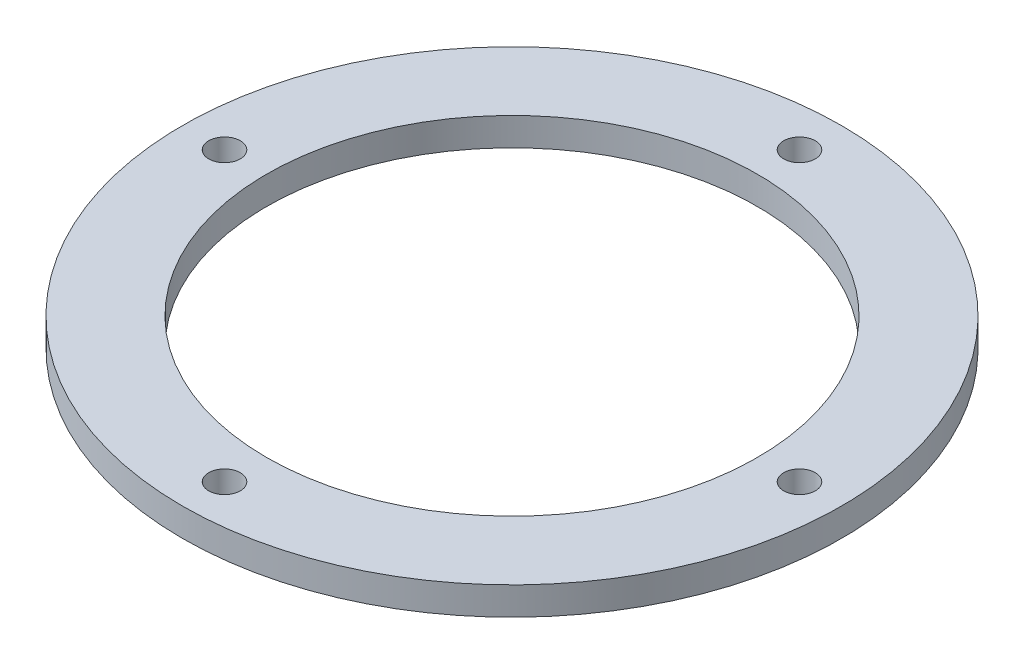
ISO-10303-21;
HEADER;
FILE_DESCRIPTION(('STEP AP214'),'2;1');
FILE_NAME('part.step','',(''),(''),'','','');
FILE_SCHEMA(('AUTOMOTIVE_DESIGN { 1 0 10303 214 1 1 1 1 }'));
ENDSEC;
DATA;
#1=APPLICATION_CONTEXT('core data for automotive mechanical design processes');
#2=APPLICATION_PROTOCOL_DEFINITION('international standard','automotive_design',2000,#1);
#3=PRODUCT_CONTEXT('',#1,'mechanical');
#4=PRODUCT('Part','Part','',(#3));
#5=PRODUCT_RELATED_PRODUCT_CATEGORY('part','',(#4));
#6=PRODUCT_DEFINITION_FORMATION('','',#4);
#7=PRODUCT_DEFINITION_CONTEXT('part definition',#1,'design');
#8=PRODUCT_DEFINITION('design','',#6,#7);
#9=PRODUCT_DEFINITION_SHAPE('','',#8);
#10=(LENGTH_UNIT() NAMED_UNIT(*) SI_UNIT(.MILLI.,.METRE.));
#11=(NAMED_UNIT(*) PLANE_ANGLE_UNIT() SI_UNIT($,.RADIAN.));
#12=(NAMED_UNIT(*) SI_UNIT($,.STERADIAN.) SOLID_ANGLE_UNIT());
#13=UNCERTAINTY_MEASURE_WITH_UNIT(LENGTH_MEASURE(1.E-05),#10,'distance_accuracy_value','');
#14=(GEOMETRIC_REPRESENTATION_CONTEXT(3) GLOBAL_UNCERTAINTY_ASSIGNED_CONTEXT((#13)) GLOBAL_UNIT_ASSIGNED_CONTEXT((#10,
#11,#12)) REPRESENTATION_CONTEXT('',''));
#15=CARTESIAN_POINT('',(0.,0.,0.));
#16=DIRECTION('',(0.,0.,1.));
#17=DIRECTION('',(1.,0.,0.));
#18=AXIS2_PLACEMENT_3D('',#15,#16,#17);
#19=CARTESIAN_POINT('',(0.,4.,0.));
#20=DIRECTION('',(0.,1.,0.));
#21=DIRECTION('',(0.,0.,1.));
#22=AXIS2_PLACEMENT_3D('',#19,#20,#21);
#23=PLANE('',#22);
#24=CARTESIAN_POINT('',(41.,4.,0.));
#25=DIRECTION('',(0.,1.,0.));
#26=DIRECTION('',(0.,0.,1.));
#27=AXIS2_PLACEMENT_3D('',#24,#25,#26);
#28=CIRCLE('',#27,2.25);
#29=CARTESIAN_POINT('',(41.,4.,2.25));
#30=VERTEX_POINT('',#29);
#31=EDGE_CURVE('E72',#30,#30,#28,.T.);
#32=ORIENTED_EDGE('',*,*,#31,.F.);
#33=EDGE_LOOP('',(#32));
#34=FACE_BOUND('',#33,.T.);
#35=CARTESIAN_POINT('',(0.,4.,41.));
#36=DIRECTION('',(0.,1.,0.));
#37=DIRECTION('',(0.,0.,1.));
#38=AXIS2_PLACEMENT_3D('',#35,#36,#37);
#39=CIRCLE('',#38,2.25);
#40=CARTESIAN_POINT('',(0.,4.,43.25));
#41=VERTEX_POINT('',#40);
#42=EDGE_CURVE('E69',#41,#41,#39,.T.);
#43=ORIENTED_EDGE('',*,*,#42,.F.);
#44=EDGE_LOOP('',(#43));
#45=FACE_BOUND('',#44,.T.);
#46=CARTESIAN_POINT('',(-41.,4.,0.));
#47=DIRECTION('',(0.,1.,0.));
#48=DIRECTION('',(0.,0.,1.));
#49=AXIS2_PLACEMENT_3D('',#46,#47,#48);
#50=CIRCLE('',#49,2.25);
#51=CARTESIAN_POINT('',(-41.,4.,2.25));
#52=VERTEX_POINT('',#51);
#53=EDGE_CURVE('E63',#52,#52,#50,.T.);
#54=ORIENTED_EDGE('',*,*,#53,.F.);
#55=EDGE_LOOP('',(#54));
#56=FACE_BOUND('',#55,.T.);
#57=CARTESIAN_POINT('',(0.,4.,-41.));
#58=DIRECTION('',(0.,1.,0.));
#59=DIRECTION('',(0.,0.,1.));
#60=AXIS2_PLACEMENT_3D('',#57,#58,#59);
#61=CIRCLE('',#60,2.25);
#62=CARTESIAN_POINT('',(0.,4.,-38.75));
#63=VERTEX_POINT('',#62);
#64=EDGE_CURVE('E57',#63,#63,#61,.T.);
#65=ORIENTED_EDGE('',*,*,#64,.F.);
#66=EDGE_LOOP('',(#65));
#67=FACE_BOUND('',#66,.T.);
#68=CARTESIAN_POINT('',(0.,4.,0.));
#69=DIRECTION('',(0.,1.,0.));
#70=DIRECTION('',(0.,0.,1.));
#71=AXIS2_PLACEMENT_3D('',#68,#69,#70);
#72=CIRCLE('',#71,47.);
#73=CARTESIAN_POINT('',(0.,4.,47.));
#74=VERTEX_POINT('',#73);
#75=EDGE_CURVE('E10',#74,#74,#72,.T.);
#76=ORIENTED_EDGE('',*,*,#75,.T.);
#77=EDGE_LOOP('',(#76));
#78=FACE_BOUND('',#77,.T.);
#79=CARTESIAN_POINT('',(0.,4.,0.));
#80=DIRECTION('',(0.,1.,0.));
#81=DIRECTION('',(0.,0.,1.));
#82=AXIS2_PLACEMENT_3D('',#79,#80,#81);
#83=CIRCLE('',#82,35.);
#84=CARTESIAN_POINT('',(0.,4.,35.));
#85=VERTEX_POINT('',#84);
#86=EDGE_CURVE('E46',#85,#85,#83,.T.);
#87=ORIENTED_EDGE('',*,*,#86,.F.);
#88=EDGE_LOOP('',(#87));
#89=FACE_BOUND('',#88,.T.);
#90=ADVANCED_FACE('F35',(#34,#45,#56,#67,#78,#89),#23,.T.);
#91=CARTESIAN_POINT('',(0.,0.,0.));
#92=DIRECTION('',(0.,1.,0.));
#93=DIRECTION('',(0.,0.,1.));
#94=AXIS2_PLACEMENT_3D('',#91,#92,#93);
#95=PLANE('',#94);
#96=CARTESIAN_POINT('',(41.,0.,0.));
#97=DIRECTION('',(0.,1.,0.));
#98=DIRECTION('',(0.,0.,1.));
#99=AXIS2_PLACEMENT_3D('',#96,#97,#98);
#100=CIRCLE('',#99,2.25);
#101=CARTESIAN_POINT('',(41.,0.,2.25));
#102=VERTEX_POINT('',#101);
#103=EDGE_CURVE('E51',#102,#102,#100,.T.);
#104=ORIENTED_EDGE('',*,*,#103,.T.);
#105=EDGE_LOOP('',(#104));
#106=FACE_BOUND('',#105,.T.);
#107=CARTESIAN_POINT('',(0.,0.,41.));
#108=DIRECTION('',(0.,1.,0.));
#109=DIRECTION('',(0.,0.,1.));
#110=AXIS2_PLACEMENT_3D('',#107,#108,#109);
#111=CIRCLE('',#110,2.25);
#112=CARTESIAN_POINT('',(0.,0.,43.25));
#113=VERTEX_POINT('',#112);
#114=EDGE_CURVE('E66',#113,#113,#111,.T.);
#115=ORIENTED_EDGE('',*,*,#114,.T.);
#116=EDGE_LOOP('',(#115));
#117=FACE_BOUND('',#116,.T.);
#118=CARTESIAN_POINT('',(-41.,0.,0.));
#119=DIRECTION('',(0.,1.,0.));
#120=DIRECTION('',(0.,0.,1.));
#121=AXIS2_PLACEMENT_3D('',#118,#119,#120);
#122=CIRCLE('',#121,2.25);
#123=CARTESIAN_POINT('',(-41.,0.,2.25));
#124=VERTEX_POINT('',#123);
#125=EDGE_CURVE('E60',#124,#124,#122,.T.);
#126=ORIENTED_EDGE('',*,*,#125,.T.);
#127=EDGE_LOOP('',(#126));
#128=FACE_BOUND('',#127,.T.);
#129=CARTESIAN_POINT('',(0.,0.,-41.));
#130=DIRECTION('',(0.,1.,0.));
#131=DIRECTION('',(0.,0.,1.));
#132=AXIS2_PLACEMENT_3D('',#129,#130,#131);
#133=CIRCLE('',#132,2.25);
#134=CARTESIAN_POINT('',(0.,0.,-38.75));
#135=VERTEX_POINT('',#134);
#136=EDGE_CURVE('E54',#135,#135,#133,.T.);
#137=ORIENTED_EDGE('',*,*,#136,.T.);
#138=EDGE_LOOP('',(#137));
#139=FACE_BOUND('',#138,.T.);
#140=CARTESIAN_POINT('',(0.,0.,0.));
#141=DIRECTION('',(0.,1.,0.));
#142=DIRECTION('',(0.,0.,1.));
#143=AXIS2_PLACEMENT_3D('',#140,#141,#142);
#144=CIRCLE('',#143,47.);
#145=CARTESIAN_POINT('',(0.,0.,47.));
#146=VERTEX_POINT('',#145);
#147=EDGE_CURVE('E39',#146,#146,#144,.T.);
#148=ORIENTED_EDGE('',*,*,#147,.F.);
#149=EDGE_LOOP('',(#148));
#150=FACE_BOUND('',#149,.T.);
#151=CARTESIAN_POINT('',(0.,0.,0.));
#152=DIRECTION('',(0.,1.,0.));
#153=DIRECTION('',(0.,0.,1.));
#154=AXIS2_PLACEMENT_3D('',#151,#152,#153);
#155=CIRCLE('',#154,35.);
#156=CARTESIAN_POINT('',(0.,0.,35.));
#157=VERTEX_POINT('',#156);
#158=EDGE_CURVE('E48',#157,#157,#155,.T.);
#159=ORIENTED_EDGE('',*,*,#158,.T.);
#160=EDGE_LOOP('',(#159));
#161=FACE_BOUND('',#160,.T.);
#162=ADVANCED_FACE('F78',(#106,#117,#128,#139,#150,#161),#95,.F.);
#163=CARTESIAN_POINT('',(0.,4.,0.));
#164=DIRECTION('',(0.,-1.,0.));
#165=DIRECTION('',(0.,0.,-1.));
#166=AXIS2_PLACEMENT_3D('',#163,#164,#165);
#167=CYLINDRICAL_SURFACE('',#166,47.);
#168=ORIENTED_EDGE('',*,*,#75,.F.);
#169=EDGE_LOOP('',(#168));
#170=FACE_BOUND('',#169,.T.);
#171=ORIENTED_EDGE('',*,*,#147,.T.);
#172=EDGE_LOOP('',(#171));
#173=FACE_BOUND('',#172,.T.);
#174=ADVANCED_FACE('F37',(#170,#173),#167,.T.);
#175=CARTESIAN_POINT('',(0.,4.,0.));
#176=DIRECTION('',(0.,-1.,0.));
#177=DIRECTION('',(0.,0.,-1.));
#178=AXIS2_PLACEMENT_3D('',#175,#176,#177);
#179=CYLINDRICAL_SURFACE('',#178,35.);
#180=ORIENTED_EDGE('',*,*,#86,.T.);
#181=EDGE_LOOP('',(#180));
#182=FACE_BOUND('',#181,.T.);
#183=ORIENTED_EDGE('',*,*,#158,.F.);
#184=EDGE_LOOP('',(#183));
#185=FACE_BOUND('',#184,.T.);
#186=ADVANCED_FACE('F99',(#182,#185),#179,.F.);
#187=CARTESIAN_POINT('',(0.,0.,-41.));
#188=DIRECTION('',(0.,1.,0.));
#189=DIRECTION('',(0.,0.,1.));
#190=AXIS2_PLACEMENT_3D('',#187,#188,#189);
#191=CYLINDRICAL_SURFACE('',#190,2.25);
#192=ORIENTED_EDGE('',*,*,#136,.F.);
#193=EDGE_LOOP('',(#192));
#194=FACE_BOUND('',#193,.T.);
#195=ORIENTED_EDGE('',*,*,#64,.T.);
#196=EDGE_LOOP('',(#195));
#197=FACE_BOUND('',#196,.T.);
#198=ADVANCED_FACE('F102',(#194,#197),#191,.F.);
#199=CARTESIAN_POINT('',(-41.,0.,0.));
#200=DIRECTION('',(0.,1.,0.));
#201=DIRECTION('',(0.,0.,1.));
#202=AXIS2_PLACEMENT_3D('',#199,#200,#201);
#203=CYLINDRICAL_SURFACE('',#202,2.25);
#204=ORIENTED_EDGE('',*,*,#125,.F.);
#205=EDGE_LOOP('',(#204));
#206=FACE_BOUND('',#205,.T.);
#207=ORIENTED_EDGE('',*,*,#53,.T.);
#208=EDGE_LOOP('',(#207));
#209=FACE_BOUND('',#208,.T.);
#210=ADVANCED_FACE('F114',(#206,#209),#203,.F.);
#211=CARTESIAN_POINT('',(0.,0.,41.));
#212=DIRECTION('',(0.,1.,0.));
#213=DIRECTION('',(0.,0.,1.));
#214=AXIS2_PLACEMENT_3D('',#211,#212,#213);
#215=CYLINDRICAL_SURFACE('',#214,2.25);
#216=ORIENTED_EDGE('',*,*,#114,.F.);
#217=EDGE_LOOP('',(#216));
#218=FACE_BOUND('',#217,.T.);
#219=ORIENTED_EDGE('',*,*,#42,.T.);
#220=EDGE_LOOP('',(#219));
#221=FACE_BOUND('',#220,.T.);
#222=ADVANCED_FACE('F84',(#218,#221),#215,.F.);
#223=CARTESIAN_POINT('',(41.,0.,0.));
#224=DIRECTION('',(0.,1.,0.));
#225=DIRECTION('',(0.,0.,1.));
#226=AXIS2_PLACEMENT_3D('',#223,#224,#225);
#227=CYLINDRICAL_SURFACE('',#226,2.25);
#228=ORIENTED_EDGE('',*,*,#103,.F.);
#229=EDGE_LOOP('',(#228));
#230=FACE_BOUND('',#229,.T.);
#231=ORIENTED_EDGE('',*,*,#31,.T.);
#232=EDGE_LOOP('',(#231));
#233=FACE_BOUND('',#232,.T.);
#234=ADVANCED_FACE('F81',(#230,#233),#227,.F.);
#235=CLOSED_SHELL('',(#90,#162,#174,#186,#198,#210,#222,#234));
#236=MANIFOLD_SOLID_BREP('B2',#235);
#237=ADVANCED_BREP_SHAPE_REPRESENTATION('',(#18,#236),#14);
#238=SHAPE_DEFINITION_REPRESENTATION(#9,#237);
ENDSEC;
END-ISO-10303-21;
